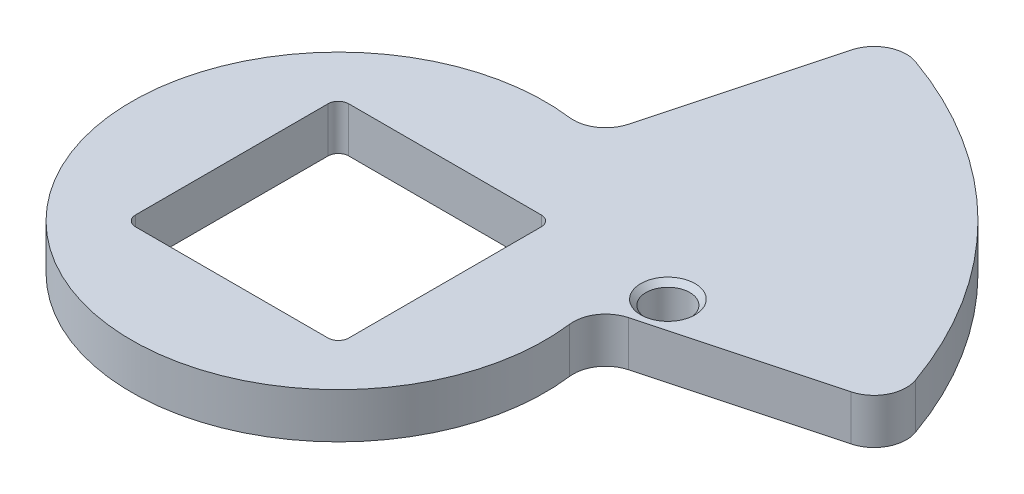
ISO-10303-21;
HEADER;
FILE_DESCRIPTION(('STEP AP214'),'2;1');
FILE_NAME('part.step','',(''),(''),'','','');
FILE_SCHEMA(('AUTOMOTIVE_DESIGN { 1 0 10303 214 1 1 1 1 }'));
ENDSEC;
DATA;
#1=APPLICATION_CONTEXT('core data for automotive mechanical design processes');
#2=APPLICATION_PROTOCOL_DEFINITION('international standard','automotive_design',2000,#1);
#3=PRODUCT_CONTEXT('',#1,'mechanical');
#4=PRODUCT('Part','Part','',(#3));
#5=PRODUCT_RELATED_PRODUCT_CATEGORY('part','',(#4));
#6=PRODUCT_DEFINITION_FORMATION('','',#4);
#7=PRODUCT_DEFINITION_CONTEXT('part definition',#1,'design');
#8=PRODUCT_DEFINITION('design','',#6,#7);
#9=PRODUCT_DEFINITION_SHAPE('','',#8);
#10=(LENGTH_UNIT() NAMED_UNIT(*) SI_UNIT(.MILLI.,.METRE.));
#11=(NAMED_UNIT(*) PLANE_ANGLE_UNIT() SI_UNIT($,.RADIAN.));
#12=(NAMED_UNIT(*) SI_UNIT($,.STERADIAN.) SOLID_ANGLE_UNIT());
#13=UNCERTAINTY_MEASURE_WITH_UNIT(LENGTH_MEASURE(1.E-05),#10,'distance_accuracy_value','');
#14=(GEOMETRIC_REPRESENTATION_CONTEXT(3) GLOBAL_UNCERTAINTY_ASSIGNED_CONTEXT((#13)) GLOBAL_UNIT_ASSIGNED_CONTEXT((#10,
#11,#12)) REPRESENTATION_CONTEXT('',''));
#15=CARTESIAN_POINT('',(0.,0.,0.));
#16=DIRECTION('',(0.,0.,1.));
#17=DIRECTION('',(1.,0.,0.));
#18=AXIS2_PLACEMENT_3D('',#15,#16,#17);
#19=CARTESIAN_POINT('',(0.,4.445,0.));
#20=DIRECTION('',(0.,-1.,0.));
#21=DIRECTION('',(0.,0.,-1.));
#22=AXIS2_PLACEMENT_3D('',#19,#20,#21);
#23=PLANE('',#22);
#24=CARTESIAN_POINT('',(22.86,4.445,-9.525));
#25=DIRECTION('',(0.,-1.,0.));
#26=DIRECTION('',(0.,0.,-1.));
#27=AXIS2_PLACEMENT_3D('',#24,#25,#26);
#28=CIRCLE('',#27,2.667);
#29=CARTESIAN_POINT('',(22.86,4.445,-12.192));
#30=VERTEX_POINT('',#29);
#31=EDGE_CURVE('E11',#30,#30,#28,.T.);
#32=ORIENTED_EDGE('',*,*,#31,.T.);
#33=EDGE_LOOP('',(#32));
#34=FACE_BOUND('',#33,.T.);
#35=CARTESIAN_POINT('',(0.,4.445,0.));
#36=DIRECTION('',(0.,1.,0.));
#37=DIRECTION('',(0.,0.,-1.));
#38=AXIS2_PLACEMENT_3D('',#35,#36,#37);
#39=CIRCLE('',#38,44.45);
#40=CARTESIAN_POINT('',(41.9232246474187,4.445,-14.7731423590943));
#41=VERTEX_POINT('',#40);
#42=CARTESIAN_POINT('',(14.7731423590947,4.445,-41.9232246474185));
#43=VERTEX_POINT('',#42);
#44=EDGE_CURVE('E194',#41,#43,#39,.T.);
#45=ORIENTED_EDGE('',*,*,#44,.T.);
#46=CARTESIAN_POINT('',(13.7179179048737,4.445,-38.9287086011743));
#47=DIRECTION('',(0.,-1.,0.));
#48=DIRECTION('',(0.,0.,-1.));
#49=AXIS2_PLACEMENT_3D('',#46,#47,#48);
#50=CIRCLE('',#49,3.175);
#51=CARTESIAN_POINT('',(10.6511034064059,4.445,-39.7504590693749));
#52=VERTEX_POINT('',#51);
#53=EDGE_CURVE('E224',#43,#52,#50,.F.);
#54=ORIENTED_EDGE('',*,*,#53,.T.);
#55=DIRECTION('',(-0.258819045102532,0.,0.965925826289065));
#56=VECTOR('',#55,1.);
#57=CARTESIAN_POINT('',(11.5045065548075,4.445,-42.9354029785489));
#58=LINE('',#57,#56);
#59=CARTESIAN_POINT('',(6.025173956631,4.445,-22.4862553305866));
#60=VERTEX_POINT('',#59);
#61=EDGE_CURVE('E337',#52,#60,#58,.T.);
#62=ORIENTED_EDGE('',*,*,#61,.T.);
#63=CARTESIAN_POINT('',(2.95835945816322,4.445,-23.3080057987872));
#64=DIRECTION('',(0.,-1.,0.));
#65=DIRECTION('',(0.,0.,-1.));
#66=AXIS2_PLACEMENT_3D('',#63,#64,#65);
#67=CIRCLE('',#66,3.175);
#68=CARTESIAN_POINT('',(2.55858115300602,4.445,-20.1582752854376));
#69=VERTEX_POINT('',#68);
#70=EDGE_CURVE('E169',#60,#69,#67,.T.);
#71=ORIENTED_EDGE('',*,*,#70,.T.);
#72=CARTESIAN_POINT('',(0.,4.445,0.));
#73=DIRECTION('',(0.,1.,0.));
#74=DIRECTION('',(0.,0.,1.));
#75=AXIS2_PLACEMENT_3D('',#72,#73,#74);
#76=CIRCLE('',#75,20.32);
#77=CARTESIAN_POINT('',(20.1582752854376,4.445,-2.55858115300581));
#78=VERTEX_POINT('',#77);
#79=EDGE_CURVE('E179',#69,#78,#76,.T.);
#80=ORIENTED_EDGE('',*,*,#79,.T.);
#81=CARTESIAN_POINT('',(23.3080057987872,4.445,-2.95835945816297));
#82=DIRECTION('',(0.,-1.,0.));
#83=DIRECTION('',(0.,0.,-1.));
#84=AXIS2_PLACEMENT_3D('',#81,#82,#83);
#85=CIRCLE('',#84,3.175);
#86=CARTESIAN_POINT('',(22.4862553305867,4.445,-6.02517395663076));
#87=VERTEX_POINT('',#86);
#88=EDGE_CURVE('E237',#78,#87,#85,.T.);
#89=ORIENTED_EDGE('',*,*,#88,.T.);
#90=DIRECTION('',(0.965925826289068,0.,-0.258819045102522));
#91=VECTOR('',#90,1.);
#92=CARTESIAN_POINT('',(42.9354029785491,4.445,-11.5045065548071));
#93=LINE('',#92,#91);
#94=CARTESIAN_POINT('',(39.750459069375,4.445,-10.6511034064055));
#95=VERTEX_POINT('',#94);
#96=EDGE_CURVE('E201',#87,#95,#93,.T.);
#97=ORIENTED_EDGE('',*,*,#96,.T.);
#98=CARTESIAN_POINT('',(38.9287086011745,4.445,-13.7179179048733));
#99=DIRECTION('',(0.,-1.,0.));
#100=DIRECTION('',(0.,0.,-1.));
#101=AXIS2_PLACEMENT_3D('',#98,#99,#100);
#102=CIRCLE('',#101,3.175);
#103=EDGE_CURVE('E221',#95,#41,#102,.F.);
#104=ORIENTED_EDGE('',*,*,#103,.T.);
#105=EDGE_LOOP('',(#45,#54,#62,#71,#80,#89,#97,#104));
#106=FACE_BOUND('',#105,.T.);
#107=DIRECTION('',(0.,0.,-1.));
#108=VECTOR('',#107,1.);
#109=CARTESIAN_POINT('',(10.4775,4.445,-10.4775));
#110=LINE('',#109,#108);
#111=CARTESIAN_POINT('',(10.4775,4.445,9.4615));
#112=VERTEX_POINT('',#111);
#113=CARTESIAN_POINT('',(10.4775,4.445,-9.4615));
#114=VERTEX_POINT('',#113);
#115=EDGE_CURVE('E328',#112,#114,#110,.T.);
#116=ORIENTED_EDGE('',*,*,#115,.F.);
#117=CARTESIAN_POINT('',(9.4615,4.445,9.4615));
#118=DIRECTION('',(0.,-1.,0.));
#119=DIRECTION('',(0.,0.,-1.));
#120=AXIS2_PLACEMENT_3D('',#117,#118,#119);
#121=CIRCLE('',#120,1.016);
#122=CARTESIAN_POINT('',(9.4615,4.445,10.4775));
#123=VERTEX_POINT('',#122);
#124=EDGE_CURVE('E270',#112,#123,#121,.T.);
#125=ORIENTED_EDGE('',*,*,#124,.T.);
#126=DIRECTION('',(1.,0.,0.));
#127=VECTOR('',#126,1.);
#128=CARTESIAN_POINT('',(-10.4775,4.445,10.4775));
#129=LINE('',#128,#127);
#130=CARTESIAN_POINT('',(-9.4615,4.445,10.4775));
#131=VERTEX_POINT('',#130);
#132=EDGE_CURVE('E347',#131,#123,#129,.T.);
#133=ORIENTED_EDGE('',*,*,#132,.F.);
#134=CARTESIAN_POINT('',(-9.4615,4.445,9.4615));
#135=DIRECTION('',(0.,-1.,0.));
#136=DIRECTION('',(0.,0.,-1.));
#137=AXIS2_PLACEMENT_3D('',#134,#135,#136);
#138=CIRCLE('',#137,1.016);
#139=CARTESIAN_POINT('',(-10.4775,4.445,9.4615));
#140=VERTEX_POINT('',#139);
#141=EDGE_CURVE('E276',#131,#140,#138,.T.);
#142=ORIENTED_EDGE('',*,*,#141,.T.);
#143=DIRECTION('',(0.,0.,1.));
#144=VECTOR('',#143,1.);
#145=CARTESIAN_POINT('',(-10.4775,4.445,-10.4775));
#146=LINE('',#145,#144);
#147=CARTESIAN_POINT('',(-10.4775,4.445,-9.4615));
#148=VERTEX_POINT('',#147);
#149=EDGE_CURVE('E353',#148,#140,#146,.T.);
#150=ORIENTED_EDGE('',*,*,#149,.F.);
#151=CARTESIAN_POINT('',(-9.4615,4.445,-9.4615));
#152=DIRECTION('',(0.,-1.,0.));
#153=DIRECTION('',(0.,0.,-1.));
#154=AXIS2_PLACEMENT_3D('',#151,#152,#153);
#155=CIRCLE('',#154,1.016);
#156=CARTESIAN_POINT('',(-9.4615,4.445,-10.4775));
#157=VERTEX_POINT('',#156);
#158=EDGE_CURVE('E58',#148,#157,#155,.T.);
#159=ORIENTED_EDGE('',*,*,#158,.T.);
#160=DIRECTION('',(-1.,0.,0.));
#161=VECTOR('',#160,1.);
#162=CARTESIAN_POINT('',(-10.4775,4.445,-10.4775));
#163=LINE('',#162,#161);
#164=CARTESIAN_POINT('',(9.4615,4.445,-10.4775));
#165=VERTEX_POINT('',#164);
#166=EDGE_CURVE('E360',#165,#157,#163,.T.);
#167=ORIENTED_EDGE('',*,*,#166,.F.);
#168=CARTESIAN_POINT('',(9.4615,4.445,-9.4615));
#169=DIRECTION('',(0.,-1.,0.));
#170=DIRECTION('',(0.,0.,-1.));
#171=AXIS2_PLACEMENT_3D('',#168,#169,#170);
#172=CIRCLE('',#171,1.016);
#173=EDGE_CURVE('E282',#165,#114,#172,.T.);
#174=ORIENTED_EDGE('',*,*,#173,.T.);
#175=EDGE_LOOP('',(#116,#125,#133,#142,#150,#159,#167,#174));
#176=FACE_BOUND('',#175,.T.);
#177=ADVANCED_FACE('F41',(#34,#106,#176),#23,.F.);
#178=CARTESIAN_POINT('',(0.,0.,0.));
#179=DIRECTION('',(0.,-1.,0.));
#180=DIRECTION('',(0.,0.,-1.));
#181=AXIS2_PLACEMENT_3D('',#178,#179,#180);
#182=PLANE('',#181);
#183=CARTESIAN_POINT('',(22.86,0.,-9.525));
#184=DIRECTION('',(0.,-1.,0.));
#185=DIRECTION('',(0.,0.,-1.));
#186=AXIS2_PLACEMENT_3D('',#183,#184,#185);
#187=CIRCLE('',#186,2.66699999999998);
#188=CARTESIAN_POINT('',(22.86,0.,-12.192));
#189=VERTEX_POINT('',#188);
#190=EDGE_CURVE('E290',#189,#189,#187,.F.);
#191=ORIENTED_EDGE('',*,*,#190,.T.);
#192=EDGE_LOOP('',(#191));
#193=FACE_BOUND('',#192,.T.);
#194=DIRECTION('',(0.,0.,1.));
#195=VECTOR('',#194,1.);
#196=CARTESIAN_POINT('',(-10.4775,0.,-10.4775));
#197=LINE('',#196,#195);
#198=CARTESIAN_POINT('',(-10.4775,0.,-9.4615));
#199=VERTEX_POINT('',#198);
#200=CARTESIAN_POINT('',(-10.4775,0.,9.4615));
#201=VERTEX_POINT('',#200);
#202=EDGE_CURVE('E316',#199,#201,#197,.T.);
#203=ORIENTED_EDGE('',*,*,#202,.T.);
#204=CARTESIAN_POINT('',(-9.4615,0.,9.4615));
#205=DIRECTION('',(0.,-1.,0.));
#206=DIRECTION('',(0.,0.,-1.));
#207=AXIS2_PLACEMENT_3D('',#204,#205,#206);
#208=CIRCLE('',#207,1.016);
#209=CARTESIAN_POINT('',(-9.4615,0.,10.4775));
#210=VERTEX_POINT('',#209);
#211=EDGE_CURVE('E273',#201,#210,#208,.F.);
#212=ORIENTED_EDGE('',*,*,#211,.T.);
#213=DIRECTION('',(1.,0.,0.));
#214=VECTOR('',#213,1.);
#215=CARTESIAN_POINT('',(-10.4775,0.,10.4775));
#216=LINE('',#215,#214);
#217=CARTESIAN_POINT('',(9.4615,0.,10.4775));
#218=VERTEX_POINT('',#217);
#219=EDGE_CURVE('E323',#210,#218,#216,.T.);
#220=ORIENTED_EDGE('',*,*,#219,.T.);
#221=CARTESIAN_POINT('',(9.4615,0.,9.4615));
#222=DIRECTION('',(0.,-1.,0.));
#223=DIRECTION('',(0.,0.,-1.));
#224=AXIS2_PLACEMENT_3D('',#221,#222,#223);
#225=CIRCLE('',#224,1.016);
#226=CARTESIAN_POINT('',(10.4775,0.,9.4615));
#227=VERTEX_POINT('',#226);
#228=EDGE_CURVE('E267',#218,#227,#225,.F.);
#229=ORIENTED_EDGE('',*,*,#228,.T.);
#230=DIRECTION('',(0.,0.,-1.));
#231=VECTOR('',#230,1.);
#232=CARTESIAN_POINT('',(10.4775,0.,-10.4775));
#233=LINE('',#232,#231);
#234=CARTESIAN_POINT('',(10.4775,0.,-9.4615));
#235=VERTEX_POINT('',#234);
#236=EDGE_CURVE('E330',#227,#235,#233,.T.);
#237=ORIENTED_EDGE('',*,*,#236,.T.);
#238=CARTESIAN_POINT('',(9.4615,0.,-9.4615));
#239=DIRECTION('',(0.,-1.,0.));
#240=DIRECTION('',(0.,0.,-1.));
#241=AXIS2_PLACEMENT_3D('',#238,#239,#240);
#242=CIRCLE('',#241,1.016);
#243=CARTESIAN_POINT('',(9.4615,0.,-10.4775));
#244=VERTEX_POINT('',#243);
#245=EDGE_CURVE('E279',#235,#244,#242,.F.);
#246=ORIENTED_EDGE('',*,*,#245,.T.);
#247=DIRECTION('',(-1.,0.,0.));
#248=VECTOR('',#247,1.);
#249=CARTESIAN_POINT('',(-10.4775,0.,-10.4775));
#250=LINE('',#249,#248);
#251=CARTESIAN_POINT('',(-9.4615,0.,-10.4775));
#252=VERTEX_POINT('',#251);
#253=EDGE_CURVE('E324',#244,#252,#250,.T.);
#254=ORIENTED_EDGE('',*,*,#253,.T.);
#255=CARTESIAN_POINT('',(-9.4615,0.,-9.4615));
#256=DIRECTION('',(0.,-1.,0.));
#257=DIRECTION('',(0.,0.,-1.));
#258=AXIS2_PLACEMENT_3D('',#255,#256,#257);
#259=CIRCLE('',#258,1.016);
#260=EDGE_CURVE('E285',#252,#199,#259,.F.);
#261=ORIENTED_EDGE('',*,*,#260,.T.);
#262=EDGE_LOOP('',(#203,#212,#220,#229,#237,#246,#254,#261));
#263=FACE_BOUND('',#262,.T.);
#264=DIRECTION('',(-0.258819045102532,0.,0.965925826289065));
#265=VECTOR('',#264,1.);
#266=CARTESIAN_POINT('',(11.5045065548075,0.,-42.9354029785489));
#267=LINE('',#266,#265);
#268=CARTESIAN_POINT('',(10.6511034064059,0.,-39.7504590693749));
#269=VERTEX_POINT('',#268);
#270=CARTESIAN_POINT('',(6.025173956631,0.,-22.4862553305866));
#271=VERTEX_POINT('',#270);
#272=EDGE_CURVE('E189',#269,#271,#267,.T.);
#273=ORIENTED_EDGE('',*,*,#272,.F.);
#274=CARTESIAN_POINT('',(13.7179179048737,0.,-38.9287086011743));
#275=DIRECTION('',(0.,-1.,0.));
#276=DIRECTION('',(0.,0.,-1.));
#277=AXIS2_PLACEMENT_3D('',#274,#275,#276);
#278=CIRCLE('',#277,3.175);
#279=CARTESIAN_POINT('',(14.7731423590947,0.,-41.9232246474185));
#280=VERTEX_POINT('',#279);
#281=EDGE_CURVE('E211',#269,#280,#278,.T.);
#282=ORIENTED_EDGE('',*,*,#281,.T.);
#283=CARTESIAN_POINT('',(0.,0.,0.));
#284=DIRECTION('',(0.,1.,0.));
#285=DIRECTION('',(0.,0.,-1.));
#286=AXIS2_PLACEMENT_3D('',#283,#284,#285);
#287=CIRCLE('',#286,44.45);
#288=CARTESIAN_POINT('',(41.9232246474187,0.,-14.7731423590943));
#289=VERTEX_POINT('',#288);
#290=EDGE_CURVE('E196',#289,#280,#287,.T.);
#291=ORIENTED_EDGE('',*,*,#290,.F.);
#292=CARTESIAN_POINT('',(38.9287086011745,0.,-13.7179179048733));
#293=DIRECTION('',(0.,-1.,0.));
#294=DIRECTION('',(0.,0.,-1.));
#295=AXIS2_PLACEMENT_3D('',#292,#293,#294);
#296=CIRCLE('',#295,3.175);
#297=CARTESIAN_POINT('',(39.750459069375,0.,-10.6511034064055));
#298=VERTEX_POINT('',#297);
#299=EDGE_CURVE('E208',#289,#298,#296,.T.);
#300=ORIENTED_EDGE('',*,*,#299,.T.);
#301=DIRECTION('',(0.965925826289068,0.,-0.258819045102522));
#302=VECTOR('',#301,1.);
#303=CARTESIAN_POINT('',(42.9354029785491,0.,-11.5045065548071));
#304=LINE('',#303,#302);
#305=CARTESIAN_POINT('',(22.4862553305867,0.,-6.02517395663076));
#306=VERTEX_POINT('',#305);
#307=EDGE_CURVE('E188',#306,#298,#304,.T.);
#308=ORIENTED_EDGE('',*,*,#307,.F.);
#309=CARTESIAN_POINT('',(23.3080057987872,0.,-2.95835945816297));
#310=DIRECTION('',(0.,-1.,0.));
#311=DIRECTION('',(0.,0.,-1.));
#312=AXIS2_PLACEMENT_3D('',#309,#310,#311);
#313=CIRCLE('',#312,3.175);
#314=CARTESIAN_POINT('',(20.1582752854376,0.,-2.55858115300581));
#315=VERTEX_POINT('',#314);
#316=EDGE_CURVE('E186',#306,#315,#313,.F.);
#317=ORIENTED_EDGE('',*,*,#316,.T.);
#318=CARTESIAN_POINT('',(0.,0.,0.));
#319=DIRECTION('',(0.,1.,0.));
#320=DIRECTION('',(0.,0.,1.));
#321=AXIS2_PLACEMENT_3D('',#318,#319,#320);
#322=CIRCLE('',#321,20.32);
#323=CARTESIAN_POINT('',(2.55858115300602,0.,-20.1582752854376));
#324=VERTEX_POINT('',#323);
#325=EDGE_CURVE('E176',#324,#315,#322,.T.);
#326=ORIENTED_EDGE('',*,*,#325,.F.);
#327=CARTESIAN_POINT('',(2.95835945816322,0.,-23.3080057987872));
#328=DIRECTION('',(0.,-1.,0.));
#329=DIRECTION('',(0.,0.,-1.));
#330=AXIS2_PLACEMENT_3D('',#327,#328,#329);
#331=CIRCLE('',#330,3.175);
#332=EDGE_CURVE('E158',#324,#271,#331,.F.);
#333=ORIENTED_EDGE('',*,*,#332,.T.);
#334=EDGE_LOOP('',(#273,#282,#291,#300,#308,#317,#326,#333));
#335=FACE_BOUND('',#334,.T.);
#336=ADVANCED_FACE('F184',(#193,#263,#335),#182,.T.);
#337=CARTESIAN_POINT('',(0.,4.445,0.));
#338=DIRECTION('',(0.,-1.,0.));
#339=DIRECTION('',(0.,0.,-1.));
#340=AXIS2_PLACEMENT_3D('',#337,#338,#339);
#341=CYLINDRICAL_SURFACE('',#340,44.45);
#342=ORIENTED_EDGE('',*,*,#290,.T.);
#343=DIRECTION('',(0.,-1.,0.));
#344=VECTOR('',#343,1.);
#345=CARTESIAN_POINT('',(14.7731423590947,4.445,-41.9232246474185));
#346=LINE('',#345,#344);
#347=EDGE_CURVE('E218',#280,#43,#346,.F.);
#348=ORIENTED_EDGE('',*,*,#347,.T.);
#349=ORIENTED_EDGE('',*,*,#44,.F.);
#350=DIRECTION('',(0.,-1.,0.));
#351=VECTOR('',#350,1.);
#352=CARTESIAN_POINT('',(41.9232246474187,4.445,-14.7731423590943));
#353=LINE('',#352,#351);
#354=EDGE_CURVE('E214',#41,#289,#353,.T.);
#355=ORIENTED_EDGE('',*,*,#354,.T.);
#356=EDGE_LOOP('',(#342,#348,#349,#355));
#357=FACE_BOUND('',#356,.T.);
#358=ADVANCED_FACE('F312',(#357),#341,.T.);
#359=CARTESIAN_POINT('',(11.5045065548075,4.445,-42.9354029785489));
#360=DIRECTION('',(0.965925826289065,0.,0.258819045102532));
#361=DIRECTION('',(0.258819045102532,0.,-0.965925826289065));
#362=AXIS2_PLACEMENT_3D('',#359,#360,#361);
#363=PLANE('',#362);
#364=ORIENTED_EDGE('',*,*,#272,.T.);
#365=DIRECTION('',(0.,1.,0.));
#366=VECTOR('',#365,1.);
#367=CARTESIAN_POINT('',(6.025173956631,4.445,-22.4862553305866));
#368=LINE('',#367,#366);
#369=EDGE_CURVE('E163',#271,#60,#368,.T.);
#370=ORIENTED_EDGE('',*,*,#369,.T.);
#371=ORIENTED_EDGE('',*,*,#61,.F.);
#372=DIRECTION('',(0.,-1.,0.));
#373=VECTOR('',#372,1.);
#374=CARTESIAN_POINT('',(10.6511034064059,4.445,-39.7504590693749));
#375=LINE('',#374,#373);
#376=EDGE_CURVE('E181',#52,#269,#375,.T.);
#377=ORIENTED_EDGE('',*,*,#376,.T.);
#378=EDGE_LOOP('',(#364,#370,#371,#377));
#379=FACE_BOUND('',#378,.T.);
#380=ADVANCED_FACE('F412',(#379),#363,.F.);
#381=CARTESIAN_POINT('',(0.,4.445,0.));
#382=DIRECTION('',(0.,-1.,0.));
#383=DIRECTION('',(0.,0.,-1.));
#384=AXIS2_PLACEMENT_3D('',#381,#382,#383);
#385=CYLINDRICAL_SURFACE('',#384,20.32);
#386=ORIENTED_EDGE('',*,*,#79,.F.);
#387=DIRECTION('',(0.,-1.,0.));
#388=VECTOR('',#387,1.);
#389=CARTESIAN_POINT('',(2.55858115300602,4.445,-20.1582752854376));
#390=LINE('',#389,#388);
#391=EDGE_CURVE('E162',#69,#324,#390,.T.);
#392=ORIENTED_EDGE('',*,*,#391,.T.);
#393=ORIENTED_EDGE('',*,*,#325,.T.);
#394=DIRECTION('',(0.,-1.,0.));
#395=VECTOR('',#394,1.);
#396=CARTESIAN_POINT('',(20.1582752854376,4.445,-2.55858115300581));
#397=LINE('',#396,#395);
#398=EDGE_CURVE('E182',#315,#78,#397,.F.);
#399=ORIENTED_EDGE('',*,*,#398,.T.);
#400=EDGE_LOOP('',(#386,#392,#393,#399));
#401=FACE_BOUND('',#400,.T.);
#402=ADVANCED_FACE('F175',(#401),#385,.T.);
#403=CARTESIAN_POINT('',(42.9354029785491,4.445,-11.5045065548071));
#404=DIRECTION('',(-0.258819045102522,0.,-0.965925826289068));
#405=DIRECTION('',(-0.965925826289068,0.,0.258819045102522));
#406=AXIS2_PLACEMENT_3D('',#403,#404,#405);
#407=PLANE('',#406);
#408=ORIENTED_EDGE('',*,*,#307,.T.);
#409=DIRECTION('',(0.,-1.,0.));
#410=VECTOR('',#409,1.);
#411=CARTESIAN_POINT('',(39.750459069375,4.445,-10.6511034064055));
#412=LINE('',#411,#410);
#413=EDGE_CURVE('E170',#298,#95,#412,.F.);
#414=ORIENTED_EDGE('',*,*,#413,.T.);
#415=ORIENTED_EDGE('',*,*,#96,.F.);
#416=DIRECTION('',(0.,1.,0.));
#417=VECTOR('',#416,1.);
#418=CARTESIAN_POINT('',(22.4862553305867,0.,-6.02517395663076));
#419=LINE('',#418,#417);
#420=EDGE_CURVE('E227',#87,#306,#419,.F.);
#421=ORIENTED_EDGE('',*,*,#420,.T.);
#422=EDGE_LOOP('',(#408,#414,#415,#421));
#423=FACE_BOUND('',#422,.T.);
#424=ADVANCED_FACE('F406',(#423),#407,.F.);
#425=CARTESIAN_POINT('',(10.4775,4.445,-10.4775));
#426=DIRECTION('',(-1.,0.,0.));
#427=DIRECTION('',(0.,0.,1.));
#428=AXIS2_PLACEMENT_3D('',#425,#426,#427);
#429=PLANE('',#428);
#430=ORIENTED_EDGE('',*,*,#236,.F.);
#431=DIRECTION('',(0.,-1.,0.));
#432=VECTOR('',#431,1.);
#433=CARTESIAN_POINT('',(10.4775,4.445,9.4615));
#434=LINE('',#433,#432);
#435=EDGE_CURVE('E251',#227,#112,#434,.F.);
#436=ORIENTED_EDGE('',*,*,#435,.T.);
#437=ORIENTED_EDGE('',*,*,#115,.T.);
#438=DIRECTION('',(0.,-1.,0.));
#439=VECTOR('',#438,1.);
#440=CARTESIAN_POINT('',(10.4775,0.,-9.4615));
#441=LINE('',#440,#439);
#442=EDGE_CURVE('E247',#114,#235,#441,.T.);
#443=ORIENTED_EDGE('',*,*,#442,.T.);
#444=EDGE_LOOP('',(#430,#436,#437,#443));
#445=FACE_BOUND('',#444,.T.);
#446=ADVANCED_FACE('F368',(#445),#429,.T.);
#447=CARTESIAN_POINT('',(-10.4775,4.445,-10.4775));
#448=DIRECTION('',(0.,0.,1.));
#449=DIRECTION('',(1.,0.,0.));
#450=AXIS2_PLACEMENT_3D('',#447,#448,#449);
#451=PLANE('',#450);
#452=ORIENTED_EDGE('',*,*,#253,.F.);
#453=DIRECTION('',(0.,-1.,0.));
#454=VECTOR('',#453,1.);
#455=CARTESIAN_POINT('',(9.4615,4.445,-10.4775));
#456=LINE('',#455,#454);
#457=EDGE_CURVE('E65',#244,#165,#456,.F.);
#458=ORIENTED_EDGE('',*,*,#457,.T.);
#459=ORIENTED_EDGE('',*,*,#166,.T.);
#460=DIRECTION('',(0.,-1.,0.));
#461=VECTOR('',#460,1.);
#462=CARTESIAN_POINT('',(-9.4615,0.,-10.4775));
#463=LINE('',#462,#461);
#464=EDGE_CURVE('E261',#157,#252,#463,.T.);
#465=ORIENTED_EDGE('',*,*,#464,.T.);
#466=EDGE_LOOP('',(#452,#458,#459,#465));
#467=FACE_BOUND('',#466,.T.);
#468=ADVANCED_FACE('F381',(#467),#451,.T.);
#469=CARTESIAN_POINT('',(-10.4775,4.445,-10.4775));
#470=DIRECTION('',(1.,0.,0.));
#471=DIRECTION('',(0.,0.,-1.));
#472=AXIS2_PLACEMENT_3D('',#469,#470,#471);
#473=PLANE('',#472);
#474=ORIENTED_EDGE('',*,*,#149,.T.);
#475=DIRECTION('',(0.,-1.,0.));
#476=VECTOR('',#475,1.);
#477=CARTESIAN_POINT('',(-10.4775,0.,9.4615));
#478=LINE('',#477,#476);
#479=EDGE_CURVE('E257',#140,#201,#478,.T.);
#480=ORIENTED_EDGE('',*,*,#479,.T.);
#481=ORIENTED_EDGE('',*,*,#202,.F.);
#482=DIRECTION('',(0.,-1.,0.));
#483=VECTOR('',#482,1.);
#484=CARTESIAN_POINT('',(-10.4775,4.445,-9.4615));
#485=LINE('',#484,#483);
#486=EDGE_CURVE('E254',#199,#148,#485,.F.);
#487=ORIENTED_EDGE('',*,*,#486,.T.);
#488=EDGE_LOOP('',(#474,#480,#481,#487));
#489=FACE_BOUND('',#488,.T.);
#490=ADVANCED_FACE('F383',(#489),#473,.T.);
#491=CARTESIAN_POINT('',(-10.4775,4.445,10.4775));
#492=DIRECTION('',(0.,0.,-1.));
#493=DIRECTION('',(-1.,0.,0.));
#494=AXIS2_PLACEMENT_3D('',#491,#492,#493);
#495=PLANE('',#494);
#496=ORIENTED_EDGE('',*,*,#132,.T.);
#497=DIRECTION('',(0.,-1.,0.));
#498=VECTOR('',#497,1.);
#499=CARTESIAN_POINT('',(9.4615,0.,10.4775));
#500=LINE('',#499,#498);
#501=EDGE_CURVE('E243',#123,#218,#500,.T.);
#502=ORIENTED_EDGE('',*,*,#501,.T.);
#503=ORIENTED_EDGE('',*,*,#219,.F.);
#504=DIRECTION('',(0.,-1.,0.));
#505=VECTOR('',#504,1.);
#506=CARTESIAN_POINT('',(-9.4615,4.445,10.4775));
#507=LINE('',#506,#505);
#508=EDGE_CURVE('E240',#210,#131,#507,.F.);
#509=ORIENTED_EDGE('',*,*,#508,.T.);
#510=EDGE_LOOP('',(#496,#502,#503,#509));
#511=FACE_BOUND('',#510,.T.);
#512=ADVANCED_FACE('F388',(#511),#495,.T.);
#513=CARTESIAN_POINT('',(22.86,4.445,-9.525));
#514=DIRECTION('',(0.,-1.,0.));
#515=DIRECTION('',(0.,0.,-1.));
#516=AXIS2_PLACEMENT_3D('',#513,#514,#515);
#517=CYLINDRICAL_SURFACE('',#516,2.159);
#518=CARTESIAN_POINT('',(22.86,0.507999999999973,-9.525));
#519=DIRECTION('',(0.,-1.,0.));
#520=DIRECTION('',(0.,0.,-1.));
#521=AXIS2_PLACEMENT_3D('',#518,#519,#520);
#522=CIRCLE('',#521,2.159);
#523=CARTESIAN_POINT('',(22.86,0.507999999999973,-11.684));
#524=VERTEX_POINT('',#523);
#525=EDGE_CURVE('E51',#524,#524,#522,.T.);
#526=ORIENTED_EDGE('',*,*,#525,.T.);
#527=EDGE_LOOP('',(#526));
#528=FACE_BOUND('',#527,.T.);
#529=CARTESIAN_POINT('',(22.86,3.937,-9.525));
#530=DIRECTION('',(0.,-1.,0.));
#531=DIRECTION('',(0.,0.,-1.));
#532=AXIS2_PLACEMENT_3D('',#529,#530,#531);
#533=CIRCLE('',#532,2.159);
#534=CARTESIAN_POINT('',(22.86,3.937,-11.684));
#535=VERTEX_POINT('',#534);
#536=EDGE_CURVE('E294',#535,#535,#533,.F.);
#537=ORIENTED_EDGE('',*,*,#536,.T.);
#538=EDGE_LOOP('',(#537));
#539=FACE_BOUND('',#538,.T.);
#540=ADVANCED_FACE('F301',(#528,#539),#517,.F.);
#541=CARTESIAN_POINT('',(2.95835945816322,4.445,-23.3080057987872));
#542=DIRECTION('',(0.,-1.,0.));
#543=DIRECTION('',(0.,0.,-1.));
#544=AXIS2_PLACEMENT_3D('',#541,#542,#543);
#545=CYLINDRICAL_SURFACE('',#544,3.175);
#546=ORIENTED_EDGE('',*,*,#70,.F.);
#547=ORIENTED_EDGE('',*,*,#369,.F.);
#548=ORIENTED_EDGE('',*,*,#332,.F.);
#549=ORIENTED_EDGE('',*,*,#391,.F.);
#550=EDGE_LOOP('',(#546,#547,#548,#549));
#551=FACE_BOUND('',#550,.T.);
#552=ADVANCED_FACE('F161',(#551),#545,.F.);
#553=CARTESIAN_POINT('',(13.7179179048737,4.445,-38.9287086011743));
#554=DIRECTION('',(0.,-1.,0.));
#555=DIRECTION('',(0.,0.,-1.));
#556=AXIS2_PLACEMENT_3D('',#553,#554,#555);
#557=CYLINDRICAL_SURFACE('',#556,3.175);
#558=ORIENTED_EDGE('',*,*,#53,.F.);
#559=ORIENTED_EDGE('',*,*,#347,.F.);
#560=ORIENTED_EDGE('',*,*,#281,.F.);
#561=ORIENTED_EDGE('',*,*,#376,.F.);
#562=EDGE_LOOP('',(#558,#559,#560,#561));
#563=FACE_BOUND('',#562,.T.);
#564=ADVANCED_FACE('F420',(#563),#557,.T.);
#565=CARTESIAN_POINT('',(38.9287086011745,4.445,-13.7179179048733));
#566=DIRECTION('',(0.,-1.,0.));
#567=DIRECTION('',(0.,0.,-1.));
#568=AXIS2_PLACEMENT_3D('',#565,#566,#567);
#569=CYLINDRICAL_SURFACE('',#568,3.175);
#570=ORIENTED_EDGE('',*,*,#103,.F.);
#571=ORIENTED_EDGE('',*,*,#413,.F.);
#572=ORIENTED_EDGE('',*,*,#299,.F.);
#573=ORIENTED_EDGE('',*,*,#354,.F.);
#574=EDGE_LOOP('',(#570,#571,#572,#573));
#575=FACE_BOUND('',#574,.T.);
#576=ADVANCED_FACE('F423',(#575),#569,.T.);
#577=CARTESIAN_POINT('',(23.3080057987872,4.445,-2.95835945816297));
#578=DIRECTION('',(0.,-1.,0.));
#579=DIRECTION('',(0.,0.,-1.));
#580=AXIS2_PLACEMENT_3D('',#577,#578,#579);
#581=CYLINDRICAL_SURFACE('',#580,3.175);
#582=ORIENTED_EDGE('',*,*,#88,.F.);
#583=ORIENTED_EDGE('',*,*,#398,.F.);
#584=ORIENTED_EDGE('',*,*,#316,.F.);
#585=ORIENTED_EDGE('',*,*,#420,.F.);
#586=EDGE_LOOP('',(#582,#583,#584,#585));
#587=FACE_BOUND('',#586,.T.);
#588=ADVANCED_FACE('F427',(#587),#581,.F.);
#589=CARTESIAN_POINT('',(9.4615,4.445,9.4615));
#590=DIRECTION('',(0.,1.,0.));
#591=DIRECTION('',(0.,0.,1.));
#592=AXIS2_PLACEMENT_3D('',#589,#590,#591);
#593=CYLINDRICAL_SURFACE('',#592,1.016);
#594=ORIENTED_EDGE('',*,*,#124,.F.);
#595=ORIENTED_EDGE('',*,*,#435,.F.);
#596=ORIENTED_EDGE('',*,*,#228,.F.);
#597=ORIENTED_EDGE('',*,*,#501,.F.);
#598=EDGE_LOOP('',(#594,#595,#596,#597));
#599=FACE_BOUND('',#598,.T.);
#600=ADVANCED_FACE('F374',(#599),#593,.F.);
#601=CARTESIAN_POINT('',(-9.4615,4.445,9.4615));
#602=DIRECTION('',(0.,1.,0.));
#603=DIRECTION('',(0.,0.,1.));
#604=AXIS2_PLACEMENT_3D('',#601,#602,#603);
#605=CYLINDRICAL_SURFACE('',#604,1.016);
#606=ORIENTED_EDGE('',*,*,#141,.F.);
#607=ORIENTED_EDGE('',*,*,#508,.F.);
#608=ORIENTED_EDGE('',*,*,#211,.F.);
#609=ORIENTED_EDGE('',*,*,#479,.F.);
#610=EDGE_LOOP('',(#606,#607,#608,#609));
#611=FACE_BOUND('',#610,.T.);
#612=ADVANCED_FACE('F387',(#611),#605,.F.);
#613=CARTESIAN_POINT('',(9.4615,4.445,-9.4615));
#614=DIRECTION('',(0.,1.,0.));
#615=DIRECTION('',(0.,0.,1.));
#616=AXIS2_PLACEMENT_3D('',#613,#614,#615);
#617=CYLINDRICAL_SURFACE('',#616,1.016);
#618=ORIENTED_EDGE('',*,*,#173,.F.);
#619=ORIENTED_EDGE('',*,*,#457,.F.);
#620=ORIENTED_EDGE('',*,*,#245,.F.);
#621=ORIENTED_EDGE('',*,*,#442,.F.);
#622=EDGE_LOOP('',(#618,#619,#620,#621));
#623=FACE_BOUND('',#622,.T.);
#624=ADVANCED_FACE('F436',(#623),#617,.F.);
#625=CARTESIAN_POINT('',(-9.4615,4.445,-9.4615));
#626=DIRECTION('',(0.,1.,0.));
#627=DIRECTION('',(0.,0.,1.));
#628=AXIS2_PLACEMENT_3D('',#625,#626,#627);
#629=CYLINDRICAL_SURFACE('',#628,1.016);
#630=ORIENTED_EDGE('',*,*,#158,.F.);
#631=ORIENTED_EDGE('',*,*,#486,.F.);
#632=ORIENTED_EDGE('',*,*,#260,.F.);
#633=ORIENTED_EDGE('',*,*,#464,.F.);
#634=EDGE_LOOP('',(#630,#631,#632,#633));
#635=FACE_BOUND('',#634,.T.);
#636=ADVANCED_FACE('F307',(#635),#629,.F.);
#637=CARTESIAN_POINT('',(22.86,0.,-9.525));
#638=DIRECTION('',(0.,-1.,0.));
#639=DIRECTION('',(0.,0.,-1.));
#640=AXIS2_PLACEMENT_3D('',#637,#638,#639);
#641=CONICAL_SURFACE('',#640,2.66699999999998,0.785398163397456);
#642=ORIENTED_EDGE('',*,*,#525,.F.);
#643=EDGE_LOOP('',(#642));
#644=FACE_BOUND('',#643,.T.);
#645=ORIENTED_EDGE('',*,*,#190,.F.);
#646=EDGE_LOOP('',(#645));
#647=FACE_BOUND('',#646,.T.);
#648=ADVANCED_FACE('F304',(#644,#647),#641,.F.);
#649=CARTESIAN_POINT('',(22.86,3.937,-9.525));
#650=DIRECTION('',(0.,1.,0.));
#651=DIRECTION('',(0.,0.,1.));
#652=AXIS2_PLACEMENT_3D('',#649,#650,#651);
#653=CONICAL_SURFACE('',#652,2.159,0.785398163397454);
#654=ORIENTED_EDGE('',*,*,#31,.F.);
#655=EDGE_LOOP('',(#654));
#656=FACE_BOUND('',#655,.T.);
#657=ORIENTED_EDGE('',*,*,#536,.F.);
#658=EDGE_LOOP('',(#657));
#659=FACE_BOUND('',#658,.T.);
#660=ADVANCED_FACE('F44',(#656,#659),#653,.F.);
#661=CLOSED_SHELL('',(#177,#336,#358,#380,#402,#424,#446,#468,#490,#512,#540,#552,#564,#576,
#588,#600,#612,#624,#636,#648,#660));
#662=MANIFOLD_SOLID_BREP('B2',#661);
#663=ADVANCED_BREP_SHAPE_REPRESENTATION('',(#18,#662),#14);
#664=SHAPE_DEFINITION_REPRESENTATION(#9,#663);
ENDSEC;
END-ISO-10303-21;
